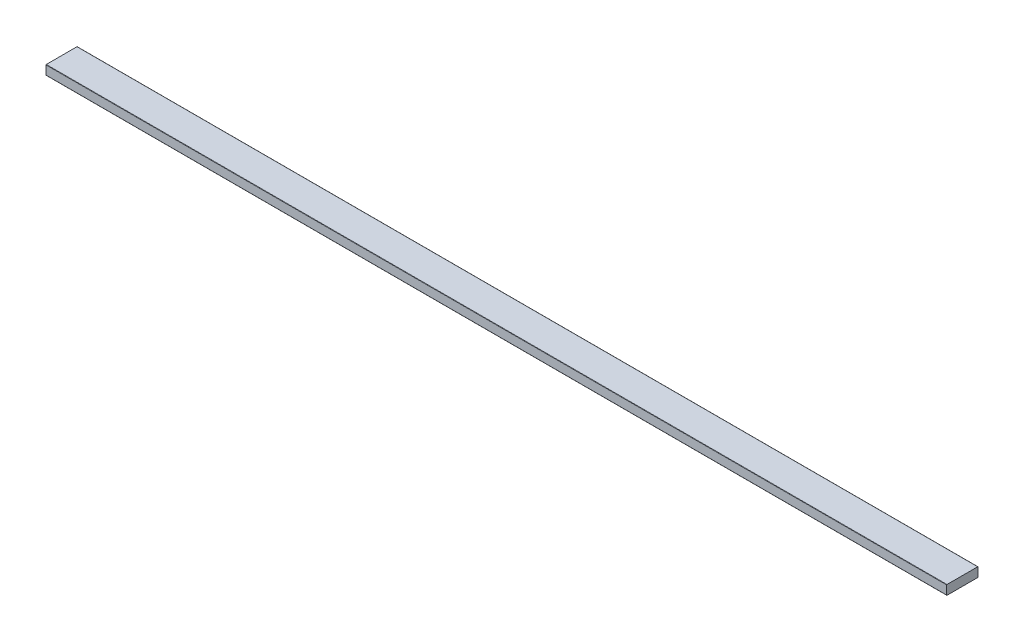
ISO-10303-21;
HEADER;
FILE_DESCRIPTION(('STEP AP214'),'2;1');
FILE_NAME('part.step','',(''),(''),'','','');
FILE_SCHEMA(('AUTOMOTIVE_DESIGN { 1 0 10303 214 1 1 1 1 }'));
ENDSEC;
DATA;
#1=APPLICATION_CONTEXT('core data for automotive mechanical design processes');
#2=APPLICATION_PROTOCOL_DEFINITION('international standard','automotive_design',2000,#1);
#3=PRODUCT_CONTEXT('',#1,'mechanical');
#4=PRODUCT('Part','Part','',(#3));
#5=PRODUCT_RELATED_PRODUCT_CATEGORY('part','',(#4));
#6=PRODUCT_DEFINITION_FORMATION('','',#4);
#7=PRODUCT_DEFINITION_CONTEXT('part definition',#1,'design');
#8=PRODUCT_DEFINITION('design','',#6,#7);
#9=PRODUCT_DEFINITION_SHAPE('','',#8);
#10=(LENGTH_UNIT() NAMED_UNIT(*) SI_UNIT(.MILLI.,.METRE.));
#11=(NAMED_UNIT(*) PLANE_ANGLE_UNIT() SI_UNIT($,.RADIAN.));
#12=(NAMED_UNIT(*) SI_UNIT($,.STERADIAN.) SOLID_ANGLE_UNIT());
#13=UNCERTAINTY_MEASURE_WITH_UNIT(LENGTH_MEASURE(1.E-05),#10,'distance_accuracy_value','');
#14=(GEOMETRIC_REPRESENTATION_CONTEXT(3) GLOBAL_UNCERTAINTY_ASSIGNED_CONTEXT((#13)) GLOBAL_UNIT_ASSIGNED_CONTEXT((#10,
#11,#12)) REPRESENTATION_CONTEXT('',''));
#15=CARTESIAN_POINT('',(0.,0.,0.));
#16=DIRECTION('',(0.,0.,1.));
#17=DIRECTION('',(1.,0.,0.));
#18=AXIS2_PLACEMENT_3D('',#15,#16,#17);
#19=CARTESIAN_POINT('',(-457.2,-4.76250000000001,-15.8749999999999));
#20=DIRECTION('',(-1.,0.,0.));
#21=DIRECTION('',(0.,0.,1.));
#22=AXIS2_PLACEMENT_3D('',#19,#20,#21);
#23=PLANE('',#22);
#24=DIRECTION('',(0.,0.,1.));
#25=VECTOR('',#24,1.);
#26=CARTESIAN_POINT('',(-457.2,-4.76250000000001,-15.8749999999999));
#27=LINE('',#26,#25);
#28=CARTESIAN_POINT('',(-457.2,-4.76250000000001,-15.5606749999999));
#29=VERTEX_POINT('',#28);
#30=CARTESIAN_POINT('',(-457.2,-4.76250000000001,15.5606749999999));
#31=VERTEX_POINT('',#30);
#32=EDGE_CURVE('E191',#29,#31,#27,.T.);
#33=ORIENTED_EDGE('',*,*,#32,.T.);
#34=CARTESIAN_POINT('',(-457.2,-4.44817500000001,15.5606749999999));
#35=DIRECTION('',(-1.,0.,0.));
#36=DIRECTION('',(0.,0.,1.));
#37=AXIS2_PLACEMENT_3D('',#34,#35,#36);
#38=CIRCLE('',#37,0.314325);
#39=CARTESIAN_POINT('',(-457.2,-4.44817500000001,15.8749999999999));
#40=VERTEX_POINT('',#39);
#41=EDGE_CURVE('E169',#31,#40,#38,.T.);
#42=ORIENTED_EDGE('',*,*,#41,.T.);
#43=DIRECTION('',(0.,1.,0.));
#44=VECTOR('',#43,1.);
#45=CARTESIAN_POINT('',(-457.2,-4.76250000000001,15.8749999999999));
#46=LINE('',#45,#44);
#47=CARTESIAN_POINT('',(-457.2,4.44817499999999,15.8749999999999));
#48=VERTEX_POINT('',#47);
#49=EDGE_CURVE('E130',#40,#48,#46,.T.);
#50=ORIENTED_EDGE('',*,*,#49,.T.);
#51=CARTESIAN_POINT('',(-457.2,4.44817499999999,15.5606749999999));
#52=DIRECTION('',(-1.,0.,0.));
#53=DIRECTION('',(0.,0.,1.));
#54=AXIS2_PLACEMENT_3D('',#51,#52,#53);
#55=CIRCLE('',#54,0.314325);
#56=CARTESIAN_POINT('',(-457.2,4.76249999999999,15.5606749999999));
#57=VERTEX_POINT('',#56);
#58=EDGE_CURVE('E162',#48,#57,#55,.T.);
#59=ORIENTED_EDGE('',*,*,#58,.T.);
#60=DIRECTION('',(0.,0.,1.));
#61=VECTOR('',#60,1.);
#62=CARTESIAN_POINT('',(-457.2,4.76249999999999,-15.8749999999999));
#63=LINE('',#62,#61);
#64=CARTESIAN_POINT('',(-457.2,4.76249999999999,-15.5606749999999));
#65=VERTEX_POINT('',#64);
#66=EDGE_CURVE('E186',#65,#57,#63,.T.);
#67=ORIENTED_EDGE('',*,*,#66,.F.);
#68=CARTESIAN_POINT('',(-457.2,4.44817499999999,-15.5606749999999));
#69=DIRECTION('',(-1.,0.,0.));
#70=DIRECTION('',(0.,0.,1.));
#71=AXIS2_PLACEMENT_3D('',#68,#69,#70);
#72=CIRCLE('',#71,0.314325);
#73=CARTESIAN_POINT('',(-457.2,4.44817499999999,-15.8749999999999));
#74=VERTEX_POINT('',#73);
#75=EDGE_CURVE('E57',#65,#74,#72,.T.);
#76=ORIENTED_EDGE('',*,*,#75,.T.);
#77=DIRECTION('',(0.,1.,0.));
#78=VECTOR('',#77,1.);
#79=CARTESIAN_POINT('',(-457.2,-4.76250000000001,-15.8749999999999));
#80=LINE('',#79,#78);
#81=CARTESIAN_POINT('',(-457.2,-4.44817500000001,-15.8749999999999));
#82=VERTEX_POINT('',#81);
#83=EDGE_CURVE('E143',#82,#74,#80,.T.);
#84=ORIENTED_EDGE('',*,*,#83,.F.);
#85=CARTESIAN_POINT('',(-457.2,-4.44817500000001,-15.5606749999999));
#86=DIRECTION('',(-1.,0.,0.));
#87=DIRECTION('',(0.,0.,1.));
#88=AXIS2_PLACEMENT_3D('',#85,#86,#87);
#89=CIRCLE('',#88,0.314325);
#90=EDGE_CURVE('E65',#82,#29,#89,.T.);
#91=ORIENTED_EDGE('',*,*,#90,.T.);
#92=EDGE_LOOP('',(#33,#42,#50,#59,#67,#76,#84,#91));
#93=FACE_BOUND('',#92,.T.);
#94=ADVANCED_FACE('F41',(#93),#23,.T.);
#95=CARTESIAN_POINT('',(-457.2,-4.76250000000001,-15.8749999999999));
#96=DIRECTION('',(0.,0.,-1.));
#97=DIRECTION('',(-1.,0.,0.));
#98=AXIS2_PLACEMENT_3D('',#95,#96,#97);
#99=PLANE('',#98);
#100=DIRECTION('',(0.,1.,0.));
#101=VECTOR('',#100,1.);
#102=CARTESIAN_POINT('',(457.2,-4.76250000000001,-15.8749999999999));
#103=LINE('',#102,#101);
#104=CARTESIAN_POINT('',(457.2,-4.44817500000001,-15.8749999999999));
#105=VERTEX_POINT('',#104);
#106=CARTESIAN_POINT('',(457.2,4.44817499999999,-15.8749999999999));
#107=VERTEX_POINT('',#106);
#108=EDGE_CURVE('E138',#105,#107,#103,.T.);
#109=ORIENTED_EDGE('',*,*,#108,.F.);
#110=DIRECTION('',(-1.,0.,0.));
#111=VECTOR('',#110,1.);
#112=CARTESIAN_POINT('',(-457.2,-4.44817500000001,-15.8749999999999));
#113=LINE('',#112,#111);
#114=EDGE_CURVE('E175',#105,#82,#113,.T.);
#115=ORIENTED_EDGE('',*,*,#114,.T.);
#116=ORIENTED_EDGE('',*,*,#83,.T.);
#117=DIRECTION('',(-1.,0.,0.));
#118=VECTOR('',#117,1.);
#119=CARTESIAN_POINT('',(-457.2,4.44817499999999,-15.8749999999999));
#120=LINE('',#119,#118);
#121=EDGE_CURVE('E172',#74,#107,#120,.F.);
#122=ORIENTED_EDGE('',*,*,#121,.T.);
#123=EDGE_LOOP('',(#109,#115,#116,#122));
#124=FACE_BOUND('',#123,.T.);
#125=ADVANCED_FACE('F204',(#124),#99,.T.);
#126=CARTESIAN_POINT('',(457.2,-4.76250000000001,-15.8749999999999));
#127=DIRECTION('',(1.,0.,0.));
#128=DIRECTION('',(0.,0.,-1.));
#129=AXIS2_PLACEMENT_3D('',#126,#127,#128);
#130=PLANE('',#129);
#131=DIRECTION('',(0.,1.,0.));
#132=VECTOR('',#131,1.);
#133=CARTESIAN_POINT('',(457.2,-4.76250000000001,15.8749999999999));
#134=LINE('',#133,#132);
#135=CARTESIAN_POINT('',(457.2,-4.44817500000001,15.8749999999999));
#136=VERTEX_POINT('',#135);
#137=CARTESIAN_POINT('',(457.2,4.44817499999999,15.8749999999999));
#138=VERTEX_POINT('',#137);
#139=EDGE_CURVE('E127',#136,#138,#134,.T.);
#140=ORIENTED_EDGE('',*,*,#139,.F.);
#141=CARTESIAN_POINT('',(457.2,-4.44817500000001,15.5606749999999));
#142=DIRECTION('',(1.,0.,0.));
#143=DIRECTION('',(0.,0.,-1.));
#144=AXIS2_PLACEMENT_3D('',#141,#142,#143);
#145=CIRCLE('',#144,0.314325);
#146=CARTESIAN_POINT('',(457.2,-4.76250000000001,15.5606749999999));
#147=VERTEX_POINT('',#146);
#148=EDGE_CURVE('E109',#136,#147,#145,.T.);
#149=ORIENTED_EDGE('',*,*,#148,.T.);
#150=DIRECTION('',(0.,0.,-1.));
#151=VECTOR('',#150,1.);
#152=CARTESIAN_POINT('',(457.2,-4.76250000000001,-15.8749999999999));
#153=LINE('',#152,#151);
#154=CARTESIAN_POINT('',(457.2,-4.76250000000001,-15.5606749999999));
#155=VERTEX_POINT('',#154);
#156=EDGE_CURVE('E145',#147,#155,#153,.T.);
#157=ORIENTED_EDGE('',*,*,#156,.T.);
#158=CARTESIAN_POINT('',(457.2,-4.44817500000001,-15.5606749999999));
#159=DIRECTION('',(1.,0.,0.));
#160=DIRECTION('',(0.,0.,-1.));
#161=AXIS2_PLACEMENT_3D('',#158,#159,#160);
#162=CIRCLE('',#161,0.314325);
#163=EDGE_CURVE('E121',#155,#105,#162,.T.);
#164=ORIENTED_EDGE('',*,*,#163,.T.);
#165=ORIENTED_EDGE('',*,*,#108,.T.);
#166=CARTESIAN_POINT('',(457.2,4.44817499999999,-15.5606749999999));
#167=DIRECTION('',(1.,0.,0.));
#168=DIRECTION('',(0.,0.,-1.));
#169=AXIS2_PLACEMENT_3D('',#166,#167,#168);
#170=CIRCLE('',#169,0.314325);
#171=CARTESIAN_POINT('',(457.2,4.76249999999999,-15.5606749999999));
#172=VERTEX_POINT('',#171);
#173=EDGE_CURVE('E153',#107,#172,#170,.T.);
#174=ORIENTED_EDGE('',*,*,#173,.T.);
#175=DIRECTION('',(0.,0.,-1.));
#176=VECTOR('',#175,1.);
#177=CARTESIAN_POINT('',(457.2,4.76249999999999,-15.8749999999999));
#178=LINE('',#177,#176);
#179=CARTESIAN_POINT('',(457.2,4.76249999999999,15.5606749999999));
#180=VERTEX_POINT('',#179);
#181=EDGE_CURVE('E184',#180,#172,#178,.T.);
#182=ORIENTED_EDGE('',*,*,#181,.F.);
#183=CARTESIAN_POINT('',(457.2,4.44817499999999,15.5606749999999));
#184=DIRECTION('',(1.,0.,0.));
#185=DIRECTION('',(0.,0.,-1.));
#186=AXIS2_PLACEMENT_3D('',#183,#184,#185);
#187=CIRCLE('',#186,0.314325);
#188=EDGE_CURVE('E132',#180,#138,#187,.T.);
#189=ORIENTED_EDGE('',*,*,#188,.T.);
#190=EDGE_LOOP('',(#140,#149,#157,#164,#165,#174,#182,#189));
#191=FACE_BOUND('',#190,.T.);
#192=ADVANCED_FACE('F135',(#191),#130,.T.);
#193=CARTESIAN_POINT('',(-457.2,-4.76250000000001,15.8749999999999));
#194=DIRECTION('',(0.,0.,1.));
#195=DIRECTION('',(1.,0.,0.));
#196=AXIS2_PLACEMENT_3D('',#193,#194,#195);
#197=PLANE('',#196);
#198=ORIENTED_EDGE('',*,*,#49,.F.);
#199=DIRECTION('',(1.,0.,0.));
#200=VECTOR('',#199,1.);
#201=CARTESIAN_POINT('',(457.2,-4.44817500000001,15.8749999999999));
#202=LINE('',#201,#200);
#203=EDGE_CURVE('E113',#40,#136,#202,.T.);
#204=ORIENTED_EDGE('',*,*,#203,.T.);
#205=ORIENTED_EDGE('',*,*,#139,.T.);
#206=DIRECTION('',(1.,0.,0.));
#207=VECTOR('',#206,1.);
#208=CARTESIAN_POINT('',(-457.2,4.44817499999999,15.8749999999999));
#209=LINE('',#208,#207);
#210=EDGE_CURVE('E133',#138,#48,#209,.F.);
#211=ORIENTED_EDGE('',*,*,#210,.T.);
#212=EDGE_LOOP('',(#198,#204,#205,#211));
#213=FACE_BOUND('',#212,.T.);
#214=ADVANCED_FACE('F126',(#213),#197,.T.);
#215=CARTESIAN_POINT('',(0.,-4.76250000000001,0.));
#216=DIRECTION('',(0.,1.,0.));
#217=DIRECTION('',(0.,0.,1.));
#218=AXIS2_PLACEMENT_3D('',#215,#216,#217);
#219=PLANE('',#218);
#220=ORIENTED_EDGE('',*,*,#156,.F.);
#221=DIRECTION('',(1.,0.,0.));
#222=VECTOR('',#221,1.);
#223=CARTESIAN_POINT('',(-457.2,-4.76250000000001,15.5606749999999));
#224=LINE('',#223,#222);
#225=EDGE_CURVE('E114',#147,#31,#224,.F.);
#226=ORIENTED_EDGE('',*,*,#225,.T.);
#227=ORIENTED_EDGE('',*,*,#32,.F.);
#228=DIRECTION('',(-1.,0.,0.));
#229=VECTOR('',#228,1.);
#230=CARTESIAN_POINT('',(457.2,-4.76250000000001,-15.5606749999999));
#231=LINE('',#230,#229);
#232=EDGE_CURVE('E120',#29,#155,#231,.F.);
#233=ORIENTED_EDGE('',*,*,#232,.T.);
#234=EDGE_LOOP('',(#220,#226,#227,#233));
#235=FACE_BOUND('',#234,.T.);
#236=ADVANCED_FACE('F228',(#235),#219,.F.);
#237=CARTESIAN_POINT('',(0.,4.76249999999999,0.));
#238=DIRECTION('',(0.,1.,0.));
#239=DIRECTION('',(0.,0.,1.));
#240=AXIS2_PLACEMENT_3D('',#237,#238,#239);
#241=PLANE('',#240);
#242=ORIENTED_EDGE('',*,*,#181,.T.);
#243=DIRECTION('',(-1.,0.,0.));
#244=VECTOR('',#243,1.);
#245=CARTESIAN_POINT('',(0.,4.76249999999999,-15.5606749999999));
#246=LINE('',#245,#244);
#247=EDGE_CURVE('E11',#172,#65,#246,.T.);
#248=ORIENTED_EDGE('',*,*,#247,.T.);
#249=ORIENTED_EDGE('',*,*,#66,.T.);
#250=DIRECTION('',(1.,0.,0.));
#251=VECTOR('',#250,1.);
#252=CARTESIAN_POINT('',(0.,4.76249999999999,15.5606749999999));
#253=LINE('',#252,#251);
#254=EDGE_CURVE('E50',#57,#180,#253,.T.);
#255=ORIENTED_EDGE('',*,*,#254,.T.);
#256=EDGE_LOOP('',(#242,#248,#249,#255));
#257=FACE_BOUND('',#256,.T.);
#258=ADVANCED_FACE('F183',(#257),#241,.T.);
#259=CARTESIAN_POINT('',(-457.2,-4.44817500000001,15.5606749999999));
#260=DIRECTION('',(-1.,0.,0.));
#261=DIRECTION('',(0.,0.,1.));
#262=AXIS2_PLACEMENT_3D('',#259,#260,#261);
#263=CYLINDRICAL_SURFACE('',#262,0.314325);
#264=ORIENTED_EDGE('',*,*,#41,.F.);
#265=ORIENTED_EDGE('',*,*,#225,.F.);
#266=ORIENTED_EDGE('',*,*,#148,.F.);
#267=ORIENTED_EDGE('',*,*,#203,.F.);
#268=EDGE_LOOP('',(#264,#265,#266,#267));
#269=FACE_BOUND('',#268,.T.);
#270=ADVANCED_FACE('F112',(#269),#263,.T.);
#271=CARTESIAN_POINT('',(-457.2,-4.44817500000001,-15.5606749999999));
#272=DIRECTION('',(1.,0.,0.));
#273=DIRECTION('',(0.,0.,-1.));
#274=AXIS2_PLACEMENT_3D('',#271,#272,#273);
#275=CYLINDRICAL_SURFACE('',#274,0.314325);
#276=ORIENTED_EDGE('',*,*,#163,.F.);
#277=ORIENTED_EDGE('',*,*,#232,.F.);
#278=ORIENTED_EDGE('',*,*,#90,.F.);
#279=ORIENTED_EDGE('',*,*,#114,.F.);
#280=EDGE_LOOP('',(#276,#277,#278,#279));
#281=FACE_BOUND('',#280,.T.);
#282=ADVANCED_FACE('F211',(#281),#275,.T.);
#283=CARTESIAN_POINT('',(0.,4.44817499999999,-15.5606749999999));
#284=DIRECTION('',(-1.,0.,0.));
#285=DIRECTION('',(0.,0.,1.));
#286=AXIS2_PLACEMENT_3D('',#283,#284,#285);
#287=CYLINDRICAL_SURFACE('',#286,0.314325);
#288=ORIENTED_EDGE('',*,*,#173,.F.);
#289=ORIENTED_EDGE('',*,*,#121,.F.);
#290=ORIENTED_EDGE('',*,*,#75,.F.);
#291=ORIENTED_EDGE('',*,*,#247,.F.);
#292=EDGE_LOOP('',(#288,#289,#290,#291));
#293=FACE_BOUND('',#292,.T.);
#294=ADVANCED_FACE('F206',(#293),#287,.T.);
#295=CARTESIAN_POINT('',(0.,4.44817499999999,15.5606749999999));
#296=DIRECTION('',(1.,0.,0.));
#297=DIRECTION('',(0.,0.,-1.));
#298=AXIS2_PLACEMENT_3D('',#295,#296,#297);
#299=CYLINDRICAL_SURFACE('',#298,0.314325);
#300=ORIENTED_EDGE('',*,*,#58,.F.);
#301=ORIENTED_EDGE('',*,*,#210,.F.);
#302=ORIENTED_EDGE('',*,*,#188,.F.);
#303=ORIENTED_EDGE('',*,*,#254,.F.);
#304=EDGE_LOOP('',(#300,#301,#302,#303));
#305=FACE_BOUND('',#304,.T.);
#306=ADVANCED_FACE('F43',(#305),#299,.T.);
#307=CLOSED_SHELL('',(#94,#125,#192,#214,#236,#258,#270,#282,#294,#306));
#308=MANIFOLD_SOLID_BREP('B2',#307);
#309=ADVANCED_BREP_SHAPE_REPRESENTATION('',(#18,#308),#14);
#310=SHAPE_DEFINITION_REPRESENTATION(#9,#309);
ENDSEC;
END-ISO-10303-21;
